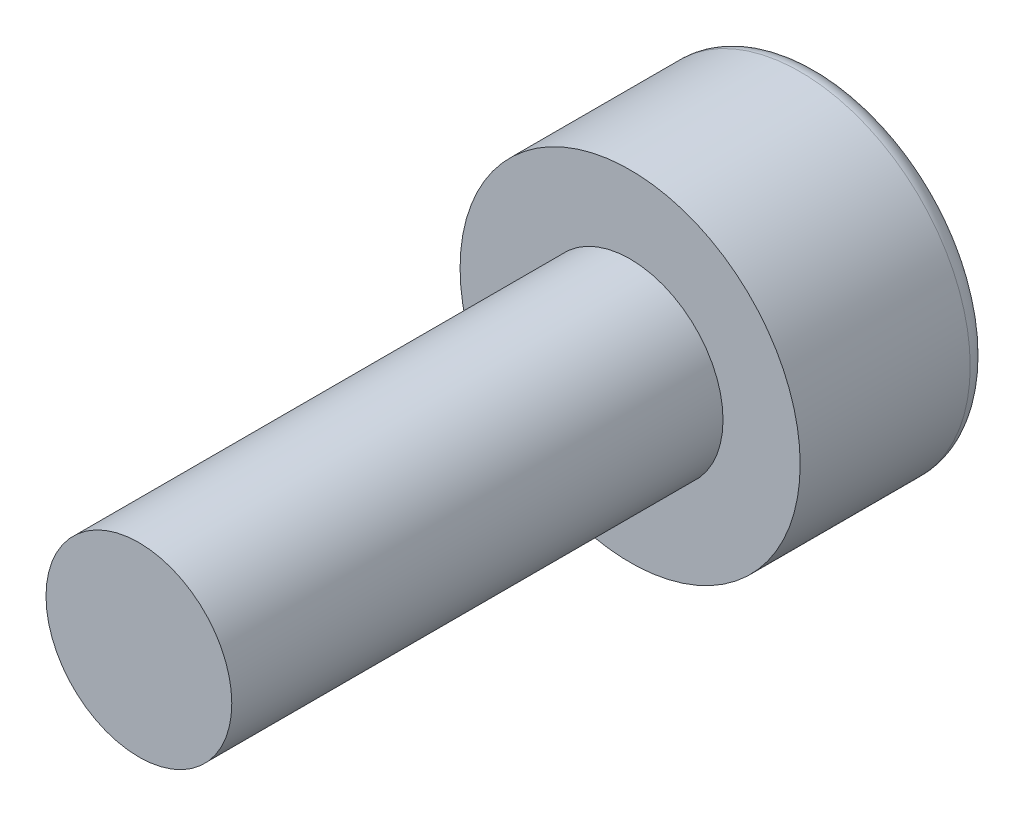
ISO-10303-21;
HEADER;
FILE_DESCRIPTION(('STEP AP214'),'2;1');
FILE_NAME('part.step','',(''),(''),'','','');
FILE_SCHEMA(('AUTOMOTIVE_DESIGN { 1 0 10303 214 1 1 1 1 }'));
ENDSEC;
DATA;
#1=APPLICATION_CONTEXT('core data for automotive mechanical design processes');
#2=APPLICATION_PROTOCOL_DEFINITION('international standard','automotive_design',2000,#1);
#3=PRODUCT_CONTEXT('',#1,'mechanical');
#4=PRODUCT('Part','Part','',(#3));
#5=PRODUCT_RELATED_PRODUCT_CATEGORY('part','',(#4));
#6=PRODUCT_DEFINITION_FORMATION('','',#4);
#7=PRODUCT_DEFINITION_CONTEXT('part definition',#1,'design');
#8=PRODUCT_DEFINITION('design','',#6,#7);
#9=PRODUCT_DEFINITION_SHAPE('','',#8);
#10=(LENGTH_UNIT() NAMED_UNIT(*) SI_UNIT(.MILLI.,.METRE.));
#11=(NAMED_UNIT(*) PLANE_ANGLE_UNIT() SI_UNIT($,.RADIAN.));
#12=(NAMED_UNIT(*) SI_UNIT($,.STERADIAN.) SOLID_ANGLE_UNIT());
#13=UNCERTAINTY_MEASURE_WITH_UNIT(LENGTH_MEASURE(1.E-05),#10,'distance_accuracy_value','');
#14=(GEOMETRIC_REPRESENTATION_CONTEXT(3) GLOBAL_UNCERTAINTY_ASSIGNED_CONTEXT((#13)) GLOBAL_UNIT_ASSIGNED_CONTEXT((#10,
#11,#12)) REPRESENTATION_CONTEXT('',''));
#15=CARTESIAN_POINT('',(0.,0.,0.));
#16=DIRECTION('',(0.,0.,1.));
#17=DIRECTION('',(1.,0.,0.));
#18=AXIS2_PLACEMENT_3D('',#15,#16,#17);
#19=CARTESIAN_POINT('',(0.,0.,7.8));
#20=DIRECTION('',(0.,0.,-1.));
#21=DIRECTION('',(-1.,0.,0.));
#22=AXIS2_PLACEMENT_3D('',#19,#20,#21);
#23=CYLINDRICAL_SURFACE('',#22,1.475);
#24=CARTESIAN_POINT('',(0.,0.,7.8));
#25=DIRECTION('',(0.,0.,1.));
#26=DIRECTION('',(1.,0.,0.));
#27=AXIS2_PLACEMENT_3D('',#24,#25,#26);
#28=CIRCLE('',#27,1.475);
#29=CARTESIAN_POINT('',(1.475,0.,7.8));
#30=VERTEX_POINT('',#29);
#31=EDGE_CURVE('E168',#30,#30,#28,.T.);
#32=ORIENTED_EDGE('',*,*,#31,.F.);
#33=EDGE_LOOP('',(#32));
#34=FACE_BOUND('',#33,.T.);
#35=CARTESIAN_POINT('',(0.,0.,0.));
#36=DIRECTION('',(0.,0.,1.));
#37=DIRECTION('',(1.,0.,0.));
#38=AXIS2_PLACEMENT_3D('',#35,#36,#37);
#39=CIRCLE('',#38,1.475);
#40=CARTESIAN_POINT('',(1.475,0.,0.));
#41=VERTEX_POINT('',#40);
#42=EDGE_CURVE('E167',#41,#41,#39,.T.);
#43=ORIENTED_EDGE('',*,*,#42,.T.);
#44=EDGE_LOOP('',(#43));
#45=FACE_BOUND('',#44,.T.);
#46=ADVANCED_FACE('F39',(#34,#45),#23,.T.);
#47=CARTESIAN_POINT('',(0.,0.,7.8));
#48=DIRECTION('',(0.,0.,1.));
#49=DIRECTION('',(1.,0.,0.));
#50=AXIS2_PLACEMENT_3D('',#47,#48,#49);
#51=PLANE('',#50);
#52=ORIENTED_EDGE('',*,*,#31,.T.);
#53=EDGE_LOOP('',(#52));
#54=FACE_BOUND('',#53,.T.);
#55=ADVANCED_FACE('F190',(#54),#51,.T.);
#56=CARTESIAN_POINT('',(0.,0.,-3.));
#57=DIRECTION('',(0.,0.,1.));
#58=DIRECTION('',(1.,0.,0.));
#59=AXIS2_PLACEMENT_3D('',#56,#57,#58);
#60=CYLINDRICAL_SURFACE('',#59,2.7);
#61=CARTESIAN_POINT('',(0.,0.,-2.7));
#62=DIRECTION('',(0.,0.,-1.));
#63=DIRECTION('',(-1.,0.,0.));
#64=AXIS2_PLACEMENT_3D('',#61,#62,#63);
#65=CIRCLE('',#64,2.7);
#66=CARTESIAN_POINT('',(-2.7,0.,-2.7));
#67=VERTEX_POINT('',#66);
#68=EDGE_CURVE('E11',#67,#67,#65,.F.);
#69=ORIENTED_EDGE('',*,*,#68,.T.);
#70=EDGE_LOOP('',(#69));
#71=FACE_BOUND('',#70,.T.);
#72=CARTESIAN_POINT('',(0.,0.,0.));
#73=DIRECTION('',(0.,0.,-1.));
#74=DIRECTION('',(-1.,0.,0.));
#75=AXIS2_PLACEMENT_3D('',#72,#73,#74);
#76=CIRCLE('',#75,2.7);
#77=CARTESIAN_POINT('',(-2.7,0.,0.));
#78=VERTEX_POINT('',#77);
#79=EDGE_CURVE('E154',#78,#78,#76,.T.);
#80=ORIENTED_EDGE('',*,*,#79,.T.);
#81=EDGE_LOOP('',(#80));
#82=FACE_BOUND('',#81,.T.);
#83=ADVANCED_FACE('F195',(#71,#82),#60,.T.);
#84=CARTESIAN_POINT('',(0.,0.,-3.));
#85=DIRECTION('',(0.,0.,-1.));
#86=DIRECTION('',(-1.,0.,0.));
#87=AXIS2_PLACEMENT_3D('',#84,#85,#86);
#88=PLANE('',#87);
#89=CARTESIAN_POINT('',(0.,0.,-3.));
#90=DIRECTION('',(0.,0.,-1.));
#91=DIRECTION('',(-1.,0.,0.));
#92=AXIS2_PLACEMENT_3D('',#89,#90,#91);
#93=CIRCLE('',#92,2.4);
#94=CARTESIAN_POINT('',(-2.4,0.,-3.));
#95=VERTEX_POINT('',#94);
#96=EDGE_CURVE('E48',#95,#95,#93,.T.);
#97=ORIENTED_EDGE('',*,*,#96,.T.);
#98=EDGE_LOOP('',(#97));
#99=FACE_BOUND('',#98,.T.);
#100=DIRECTION('',(-0.866025403784442,-0.499999999999995,0.));
#101=VECTOR('',#100,1.);
#102=CARTESIAN_POINT('',(1.5386977701661,-0.888367571806902,-3.));
#103=LINE('',#102,#101);
#104=CARTESIAN_POINT('',(1.5386977701661,-0.888367571806902,-3.));
#105=VERTEX_POINT('',#104);
#106=CARTESIAN_POINT('',(0.,-1.77673514361377,-3.));
#107=VERTEX_POINT('',#106);
#108=EDGE_CURVE('E55',#105,#107,#103,.T.);
#109=ORIENTED_EDGE('',*,*,#108,.F.);
#110=DIRECTION('',(0.,-1.,0.));
#111=VECTOR('',#110,1.);
#112=CARTESIAN_POINT('',(1.53869777016612,0.888367571806869,-3.));
#113=LINE('',#112,#111);
#114=CARTESIAN_POINT('',(1.53869777016612,0.888367571806869,-3.));
#115=VERTEX_POINT('',#114);
#116=EDGE_CURVE('E148',#115,#105,#113,.T.);
#117=ORIENTED_EDGE('',*,*,#116,.F.);
#118=DIRECTION('',(0.866025403784435,-0.500000000000007,0.));
#119=VECTOR('',#118,1.);
#120=CARTESIAN_POINT('',(0.,1.77673514361377,-3.));
#121=LINE('',#120,#119);
#122=CARTESIAN_POINT('',(0.,1.77673514361377,-3.));
#123=VERTEX_POINT('',#122);
#124=EDGE_CURVE('E145',#123,#115,#121,.T.);
#125=ORIENTED_EDGE('',*,*,#124,.F.);
#126=DIRECTION('',(0.866025403784442,0.499999999999995,0.));
#127=VECTOR('',#126,1.);
#128=CARTESIAN_POINT('',(-1.53869777016611,0.888367571806891,-3.));
#129=LINE('',#128,#127);
#130=CARTESIAN_POINT('',(-1.53869777016611,0.888367571806891,-3.));
#131=VERTEX_POINT('',#130);
#132=EDGE_CURVE('E103',#131,#123,#129,.T.);
#133=ORIENTED_EDGE('',*,*,#132,.F.);
#134=DIRECTION('',(0.,1.,0.));
#135=VECTOR('',#134,1.);
#136=CARTESIAN_POINT('',(-1.53869777016612,-0.88836757180688,-3.));
#137=LINE('',#136,#135);
#138=CARTESIAN_POINT('',(-1.53869777016612,-0.88836757180688,-3.));
#139=VERTEX_POINT('',#138);
#140=EDGE_CURVE('E139',#139,#131,#137,.T.);
#141=ORIENTED_EDGE('',*,*,#140,.F.);
#142=DIRECTION('',(-0.866025403784438,0.500000000000001,0.));
#143=VECTOR('',#142,1.);
#144=CARTESIAN_POINT('',(0.,-1.77673514361377,-3.));
#145=LINE('',#144,#143);
#146=EDGE_CURVE('E135',#107,#139,#145,.T.);
#147=ORIENTED_EDGE('',*,*,#146,.F.);
#148=EDGE_LOOP('',(#109,#117,#125,#133,#141,#147));
#149=FACE_BOUND('',#148,.T.);
#150=ADVANCED_FACE('F178',(#99,#149),#88,.T.);
#151=CARTESIAN_POINT('',(0.,0.,0.));
#152=DIRECTION('',(0.,0.,-1.));
#153=DIRECTION('',(-1.,0.,0.));
#154=AXIS2_PLACEMENT_3D('',#151,#152,#153);
#155=PLANE('',#154);
#156=ORIENTED_EDGE('',*,*,#42,.F.);
#157=EDGE_LOOP('',(#156));
#158=FACE_BOUND('',#157,.T.);
#159=ORIENTED_EDGE('',*,*,#79,.F.);
#160=EDGE_LOOP('',(#159));
#161=FACE_BOUND('',#160,.T.);
#162=ADVANCED_FACE('F204',(#158,#161),#155,.F.);
#163=CARTESIAN_POINT('',(1.5386977701661,-0.888367571806902,-0.5));
#164=DIRECTION('',(0.499999999999995,-0.866025403784442,0.));
#165=DIRECTION('',(0.866025403784442,0.499999999999995,0.));
#166=AXIS2_PLACEMENT_3D('',#163,#164,#165);
#167=PLANE('',#166);
#168=ORIENTED_EDGE('',*,*,#108,.T.);
#169=DIRECTION('',(0.,0.,-1.));
#170=VECTOR('',#169,1.);
#171=CARTESIAN_POINT('',(0.,-1.77673514361377,-0.5));
#172=LINE('',#171,#170);
#173=CARTESIAN_POINT('',(0.,-1.77673514361377,-0.5));
#174=VERTEX_POINT('',#173);
#175=EDGE_CURVE('E85',#174,#107,#172,.T.);
#176=ORIENTED_EDGE('',*,*,#175,.F.);
#177=DIRECTION('',(-0.866025403784442,-0.499999999999995,0.));
#178=VECTOR('',#177,1.);
#179=CARTESIAN_POINT('',(1.5386977701661,-0.888367571806902,-0.5));
#180=LINE('',#179,#178);
#181=CARTESIAN_POINT('',(1.5386977701661,-0.888367571806902,-0.5));
#182=VERTEX_POINT('',#181);
#183=EDGE_CURVE('E151',#182,#174,#180,.T.);
#184=ORIENTED_EDGE('',*,*,#183,.F.);
#185=DIRECTION('',(0.,0.,-1.));
#186=VECTOR('',#185,1.);
#187=CARTESIAN_POINT('',(1.5386977701661,-0.888367571806902,-0.5));
#188=LINE('',#187,#186);
#189=EDGE_CURVE('E63',#182,#105,#188,.T.);
#190=ORIENTED_EDGE('',*,*,#189,.T.);
#191=EDGE_LOOP('',(#168,#176,#184,#190));
#192=FACE_BOUND('',#191,.T.);
#193=ADVANCED_FACE('F207',(#192),#167,.F.);
#194=CARTESIAN_POINT('',(1.53869777016612,0.888367571806869,-0.5));
#195=DIRECTION('',(1.,0.,0.));
#196=DIRECTION('',(0.,1.,0.));
#197=AXIS2_PLACEMENT_3D('',#194,#195,#196);
#198=PLANE('',#197);
#199=ORIENTED_EDGE('',*,*,#116,.T.);
#200=ORIENTED_EDGE('',*,*,#189,.F.);
#201=DIRECTION('',(0.,-1.,0.));
#202=VECTOR('',#201,1.);
#203=CARTESIAN_POINT('',(1.53869777016612,0.888367571806869,-0.5));
#204=LINE('',#203,#202);
#205=CARTESIAN_POINT('',(1.53869777016612,0.888367571806869,-0.5));
#206=VERTEX_POINT('',#205);
#207=EDGE_CURVE('E117',#206,#182,#204,.T.);
#208=ORIENTED_EDGE('',*,*,#207,.F.);
#209=DIRECTION('',(0.,0.,-1.));
#210=VECTOR('',#209,1.);
#211=CARTESIAN_POINT('',(1.53869777016612,0.888367571806869,-0.5));
#212=LINE('',#211,#210);
#213=EDGE_CURVE('E108',#206,#115,#212,.T.);
#214=ORIENTED_EDGE('',*,*,#213,.T.);
#215=EDGE_LOOP('',(#199,#200,#208,#214));
#216=FACE_BOUND('',#215,.T.);
#217=ADVANCED_FACE('F213',(#216),#198,.F.);
#218=CARTESIAN_POINT('',(0.,1.77673514361377,-0.5));
#219=DIRECTION('',(0.500000000000007,0.866025403784435,0.));
#220=DIRECTION('',(-0.866025403784435,0.500000000000007,0.));
#221=AXIS2_PLACEMENT_3D('',#218,#219,#220);
#222=PLANE('',#221);
#223=ORIENTED_EDGE('',*,*,#124,.T.);
#224=ORIENTED_EDGE('',*,*,#213,.F.);
#225=DIRECTION('',(0.866025403784435,-0.500000000000007,0.));
#226=VECTOR('',#225,1.);
#227=CARTESIAN_POINT('',(0.,1.77673514361377,-0.5));
#228=LINE('',#227,#226);
#229=CARTESIAN_POINT('',(0.,1.77673514361377,-0.5));
#230=VERTEX_POINT('',#229);
#231=EDGE_CURVE('E112',#230,#206,#228,.T.);
#232=ORIENTED_EDGE('',*,*,#231,.F.);
#233=DIRECTION('',(0.,0.,-1.));
#234=VECTOR('',#233,1.);
#235=CARTESIAN_POINT('',(0.,1.77673514361377,-0.5));
#236=LINE('',#235,#234);
#237=EDGE_CURVE('E96',#230,#123,#236,.T.);
#238=ORIENTED_EDGE('',*,*,#237,.T.);
#239=EDGE_LOOP('',(#223,#224,#232,#238));
#240=FACE_BOUND('',#239,.T.);
#241=ADVANCED_FACE('F113',(#240),#222,.F.);
#242=CARTESIAN_POINT('',(-1.53869777016611,0.888367571806891,-0.5));
#243=DIRECTION('',(-0.499999999999995,0.866025403784442,0.));
#244=DIRECTION('',(-0.866025403784442,-0.499999999999995,0.));
#245=AXIS2_PLACEMENT_3D('',#242,#243,#244);
#246=PLANE('',#245);
#247=ORIENTED_EDGE('',*,*,#132,.T.);
#248=ORIENTED_EDGE('',*,*,#237,.F.);
#249=DIRECTION('',(0.866025403784442,0.499999999999995,0.));
#250=VECTOR('',#249,1.);
#251=CARTESIAN_POINT('',(-1.53869777016611,0.888367571806891,-0.5));
#252=LINE('',#251,#250);
#253=CARTESIAN_POINT('',(-1.53869777016611,0.888367571806891,-0.5));
#254=VERTEX_POINT('',#253);
#255=EDGE_CURVE('E100',#254,#230,#252,.T.);
#256=ORIENTED_EDGE('',*,*,#255,.F.);
#257=DIRECTION('',(0.,0.,-1.));
#258=VECTOR('',#257,1.);
#259=CARTESIAN_POINT('',(-1.53869777016611,0.888367571806891,-0.5));
#260=LINE('',#259,#258);
#261=EDGE_CURVE('E109',#254,#131,#260,.T.);
#262=ORIENTED_EDGE('',*,*,#261,.T.);
#263=EDGE_LOOP('',(#247,#248,#256,#262));
#264=FACE_BOUND('',#263,.T.);
#265=ADVANCED_FACE('F98',(#264),#246,.F.);
#266=CARTESIAN_POINT('',(-1.53869777016612,-0.88836757180688,-0.5));
#267=DIRECTION('',(-1.,0.,0.));
#268=DIRECTION('',(0.,-1.,0.));
#269=AXIS2_PLACEMENT_3D('',#266,#267,#268);
#270=PLANE('',#269);
#271=ORIENTED_EDGE('',*,*,#140,.T.);
#272=ORIENTED_EDGE('',*,*,#261,.F.);
#273=DIRECTION('',(0.,1.,0.));
#274=VECTOR('',#273,1.);
#275=CARTESIAN_POINT('',(-1.53869777016612,-0.88836757180688,-0.5));
#276=LINE('',#275,#274);
#277=CARTESIAN_POINT('',(-1.53869777016612,-0.88836757180688,-0.5));
#278=VERTEX_POINT('',#277);
#279=EDGE_CURVE('E123',#278,#254,#276,.T.);
#280=ORIENTED_EDGE('',*,*,#279,.F.);
#281=DIRECTION('',(0.,0.,-1.));
#282=VECTOR('',#281,1.);
#283=CARTESIAN_POINT('',(-1.53869777016612,-0.88836757180688,-0.5));
#284=LINE('',#283,#282);
#285=EDGE_CURVE('E159',#278,#139,#284,.T.);
#286=ORIENTED_EDGE('',*,*,#285,.T.);
#287=EDGE_LOOP('',(#271,#272,#280,#286));
#288=FACE_BOUND('',#287,.T.);
#289=ADVANCED_FACE('F216',(#288),#270,.F.);
#290=CARTESIAN_POINT('',(0.,-1.77673514361377,-0.5));
#291=DIRECTION('',(-0.500000000000001,-0.866025403784438,0.));
#292=DIRECTION('',(0.866025403784438,-0.500000000000001,0.));
#293=AXIS2_PLACEMENT_3D('',#290,#291,#292);
#294=PLANE('',#293);
#295=ORIENTED_EDGE('',*,*,#146,.T.);
#296=ORIENTED_EDGE('',*,*,#285,.F.);
#297=DIRECTION('',(-0.866025403784438,0.500000000000001,0.));
#298=VECTOR('',#297,1.);
#299=CARTESIAN_POINT('',(0.,-1.77673514361377,-0.5));
#300=LINE('',#299,#298);
#301=EDGE_CURVE('E127',#174,#278,#300,.T.);
#302=ORIENTED_EDGE('',*,*,#301,.F.);
#303=ORIENTED_EDGE('',*,*,#175,.T.);
#304=EDGE_LOOP('',(#295,#296,#302,#303));
#305=FACE_BOUND('',#304,.T.);
#306=ADVANCED_FACE('F186',(#305),#294,.F.);
#307=CARTESIAN_POINT('',(0.,0.,-0.5));
#308=DIRECTION('',(0.,0.,-1.));
#309=DIRECTION('',(-1.,0.,0.));
#310=AXIS2_PLACEMENT_3D('',#307,#308,#309);
#311=PLANE('',#310);
#312=ORIENTED_EDGE('',*,*,#183,.T.);
#313=ORIENTED_EDGE('',*,*,#301,.T.);
#314=ORIENTED_EDGE('',*,*,#279,.T.);
#315=ORIENTED_EDGE('',*,*,#255,.T.);
#316=ORIENTED_EDGE('',*,*,#231,.T.);
#317=ORIENTED_EDGE('',*,*,#207,.T.);
#318=EDGE_LOOP('',(#312,#313,#314,#315,#316,#317));
#319=FACE_BOUND('',#318,.T.);
#320=ADVANCED_FACE('F120',(#319),#311,.T.);
#321=CARTESIAN_POINT('',(0.,0.,-2.7));
#322=DIRECTION('',(0.,0.,-1.));
#323=DIRECTION('',(-1.,0.,0.));
#324=AXIS2_PLACEMENT_3D('',#321,#322,#323);
#325=TOROIDAL_SURFACE('',#324,2.4,0.3);
#326=ORIENTED_EDGE('',*,*,#68,.F.);
#327=EDGE_LOOP('',(#326));
#328=FACE_BOUND('',#327,.T.);
#329=ORIENTED_EDGE('',*,*,#96,.F.);
#330=EDGE_LOOP('',(#329));
#331=FACE_BOUND('',#330,.T.);
#332=ADVANCED_FACE('F41',(#328,#331),#325,.T.);
#333=CLOSED_SHELL('',(#46,#55,#83,#150,#162,#193,#217,#241,#265,#289,#306,#320,#332));
#334=MANIFOLD_SOLID_BREP('B2',#333);
#335=ADVANCED_BREP_SHAPE_REPRESENTATION('',(#18,#334),#14);
#336=SHAPE_DEFINITION_REPRESENTATION(#9,#335);
ENDSEC;
END-ISO-10303-21;
